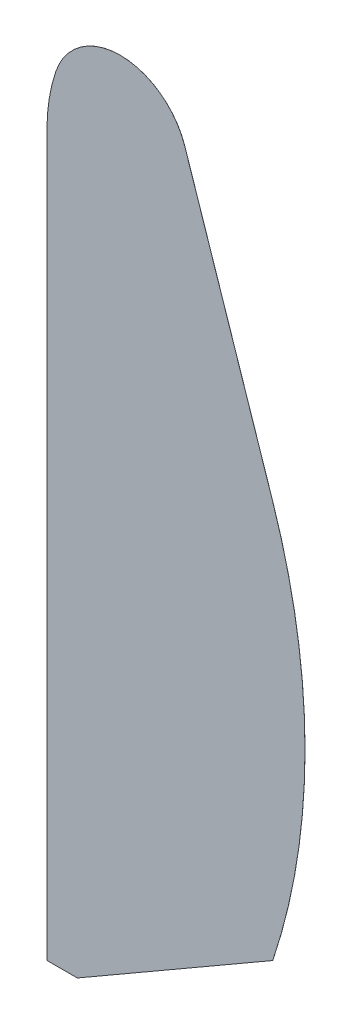
ISO-10303-21;
HEADER;
FILE_DESCRIPTION(('STEP AP214'),'2;1');
FILE_NAME('part.step','',(''),(''),'','','');
FILE_SCHEMA(('AUTOMOTIVE_DESIGN { 1 0 10303 214 1 1 1 1 }'));
ENDSEC;
DATA;
#1=APPLICATION_CONTEXT('core data for automotive mechanical design processes');
#2=APPLICATION_PROTOCOL_DEFINITION('international standard','automotive_design',2000,#1);
#3=PRODUCT_CONTEXT('',#1,'mechanical');
#4=PRODUCT('Part','Part','',(#3));
#5=PRODUCT_RELATED_PRODUCT_CATEGORY('part','',(#4));
#6=PRODUCT_DEFINITION_FORMATION('','',#4);
#7=PRODUCT_DEFINITION_CONTEXT('part definition',#1,'design');
#8=PRODUCT_DEFINITION('design','',#6,#7);
#9=PRODUCT_DEFINITION_SHAPE('','',#8);
#10=(LENGTH_UNIT() NAMED_UNIT(*) SI_UNIT(.MILLI.,.METRE.));
#11=(NAMED_UNIT(*) PLANE_ANGLE_UNIT() SI_UNIT($,.RADIAN.));
#12=(NAMED_UNIT(*) SI_UNIT($,.STERADIAN.) SOLID_ANGLE_UNIT());
#13=UNCERTAINTY_MEASURE_WITH_UNIT(LENGTH_MEASURE(1.E-05),#10,'distance_accuracy_value','');
#14=(GEOMETRIC_REPRESENTATION_CONTEXT(3) GLOBAL_UNCERTAINTY_ASSIGNED_CONTEXT((#13)) GLOBAL_UNIT_ASSIGNED_CONTEXT((#10,
#11,#12)) REPRESENTATION_CONTEXT('',''));
#15=CARTESIAN_POINT('',(0.,0.,0.));
#16=DIRECTION('',(0.,0.,1.));
#17=DIRECTION('',(1.,0.,0.));
#18=AXIS2_PLACEMENT_3D('',#15,#16,#17);
#19=CARTESIAN_POINT('',(12.0736435261267,123.957520313271,0.01));
#20=DIRECTION('',(0.,0.,-1.));
#21=DIRECTION('',(-1.,0.,0.));
#22=AXIS2_PLACEMENT_3D('',#19,#20,#21);
#23=CYLINDRICAL_SURFACE('',#22,11.1999905058393);
#24=CARTESIAN_POINT('',(12.0736435261267,123.957520313271,0.));
#25=DIRECTION('',(0.,0.,-1.));
#26=DIRECTION('',(-1.,0.,0.));
#27=AXIS2_PLACEMENT_3D('',#24,#25,#26);
#28=CIRCLE('',#27,11.1999905058393);
#29=CARTESIAN_POINT('',(1.44864352612669,127.5,0.));
#30=VERTEX_POINT('',#29);
#31=CARTESIAN_POINT('',(22.6986435261267,127.5,0.));
#32=VERTEX_POINT('',#31);
#33=EDGE_CURVE('E129',#30,#32,#28,.T.);
#34=ORIENTED_EDGE('',*,*,#33,.F.);
#35=DIRECTION('',(0.,0.,-1.));
#36=VECTOR('',#35,1.);
#37=CARTESIAN_POINT('',(1.44864352612669,127.5,0.01));
#38=LINE('',#37,#36);
#39=CARTESIAN_POINT('',(1.44864352612669,127.5,0.01));
#40=VERTEX_POINT('',#39);
#41=EDGE_CURVE('E11',#40,#30,#38,.T.);
#42=ORIENTED_EDGE('',*,*,#41,.F.);
#43=CARTESIAN_POINT('',(12.0736435261267,123.957520313271,0.01));
#44=DIRECTION('',(0.,0.,-1.));
#45=DIRECTION('',(-1.,0.,0.));
#46=AXIS2_PLACEMENT_3D('',#43,#44,#45);
#47=CIRCLE('',#46,11.1999905058393);
#48=CARTESIAN_POINT('',(22.6986435261267,127.5,0.01));
#49=VERTEX_POINT('',#48);
#50=EDGE_CURVE('E144',#40,#49,#47,.T.);
#51=ORIENTED_EDGE('',*,*,#50,.T.);
#52=DIRECTION('',(0.,0.,-1.));
#53=VECTOR('',#52,1.);
#54=CARTESIAN_POINT('',(22.6986435261267,127.5,0.01));
#55=LINE('',#54,#53);
#56=EDGE_CURVE('E42',#49,#32,#55,.T.);
#57=ORIENTED_EDGE('',*,*,#56,.T.);
#58=EDGE_LOOP('',(#34,#42,#51,#57));
#59=FACE_BOUND('',#58,.T.);
#60=ADVANCED_FACE('F41',(#59),#23,.T.);
#61=CARTESIAN_POINT('',(28.2174985050943,118.575,0.01));
#62=DIRECTION('',(0.,0.,-1.));
#63=DIRECTION('',(-1.,0.,0.));
#64=AXIS2_PLACEMENT_3D('',#61,#62,#63);
#65=CYLINDRICAL_SURFACE('',#64,28.2174985050943);
#66=CARTESIAN_POINT('',(28.2174985050943,118.575,0.));
#67=DIRECTION('',(0.,0.,-1.));
#68=DIRECTION('',(-1.,0.,0.));
#69=AXIS2_PLACEMENT_3D('',#66,#67,#68);
#70=CIRCLE('',#69,28.2174985050943);
#71=CARTESIAN_POINT('',(0.,118.575,0.));
#72=VERTEX_POINT('',#71);
#73=EDGE_CURVE('E141',#72,#30,#70,.T.);
#74=ORIENTED_EDGE('',*,*,#73,.F.);
#75=DIRECTION('',(0.,0.,-1.));
#76=VECTOR('',#75,1.);
#77=CARTESIAN_POINT('',(0.,118.575,0.01));
#78=LINE('',#77,#76);
#79=CARTESIAN_POINT('',(0.,118.575,0.01));
#80=VERTEX_POINT('',#79);
#81=EDGE_CURVE('E49',#80,#72,#78,.T.);
#82=ORIENTED_EDGE('',*,*,#81,.F.);
#83=CARTESIAN_POINT('',(28.2174985050943,118.575,0.01));
#84=DIRECTION('',(0.,0.,-1.));
#85=DIRECTION('',(-1.,0.,0.));
#86=AXIS2_PLACEMENT_3D('',#83,#84,#85);
#87=CIRCLE('',#86,28.2174985050943);
#88=EDGE_CURVE('E125',#80,#40,#87,.T.);
#89=ORIENTED_EDGE('',*,*,#88,.T.);
#90=ORIENTED_EDGE('',*,*,#41,.T.);
#91=EDGE_LOOP('',(#74,#82,#89,#90));
#92=FACE_BOUND('',#91,.T.);
#93=ADVANCED_FACE('F160',(#92),#65,.T.);
#94=CARTESIAN_POINT('',(0.,0.,0.01));
#95=DIRECTION('',(-1.,0.,0.));
#96=DIRECTION('',(0.,0.,1.));
#97=AXIS2_PLACEMENT_3D('',#94,#95,#96);
#98=PLANE('',#97);
#99=DIRECTION('',(0.,1.,0.));
#100=VECTOR('',#99,1.);
#101=CARTESIAN_POINT('',(0.,0.,0.));
#102=LINE('',#101,#100);
#103=CARTESIAN_POINT('',(0.,0.,0.));
#104=VERTEX_POINT('',#103);
#105=EDGE_CURVE('E109',#104,#72,#102,.T.);
#106=ORIENTED_EDGE('',*,*,#105,.F.);
#107=DIRECTION('',(0.,0.,-1.));
#108=VECTOR('',#107,1.);
#109=CARTESIAN_POINT('',(0.,0.,0.01));
#110=LINE('',#109,#108);
#111=CARTESIAN_POINT('',(0.,0.,0.01));
#112=VERTEX_POINT('',#111);
#113=EDGE_CURVE('E102',#112,#104,#110,.T.);
#114=ORIENTED_EDGE('',*,*,#113,.F.);
#115=DIRECTION('',(0.,1.,0.));
#116=VECTOR('',#115,1.);
#117=CARTESIAN_POINT('',(0.,0.,0.01));
#118=LINE('',#117,#116);
#119=EDGE_CURVE('E107',#112,#80,#118,.T.);
#120=ORIENTED_EDGE('',*,*,#119,.T.);
#121=ORIENTED_EDGE('',*,*,#81,.T.);
#122=EDGE_LOOP('',(#106,#114,#120,#121));
#123=FACE_BOUND('',#122,.T.);
#124=ADVANCED_FACE('F106',(#123),#98,.T.);
#125=CARTESIAN_POINT('',(0.,0.,0.01));
#126=DIRECTION('',(0.,1.,0.));
#127=DIRECTION('',(-1.,0.,0.));
#128=AXIS2_PLACEMENT_3D('',#125,#126,#127);
#129=PLANE('',#128);
#130=DIRECTION('',(1.,0.,0.));
#131=VECTOR('',#130,1.);
#132=CARTESIAN_POINT('',(0.,0.,0.));
#133=LINE('',#132,#131);
#134=CARTESIAN_POINT('',(5.,0.,0.));
#135=VERTEX_POINT('',#134);
#136=EDGE_CURVE('E136',#104,#135,#133,.T.);
#137=ORIENTED_EDGE('',*,*,#136,.T.);
#138=DIRECTION('',(0.,0.,-1.));
#139=VECTOR('',#138,1.);
#140=CARTESIAN_POINT('',(5.,0.,0.01));
#141=LINE('',#140,#139);
#142=CARTESIAN_POINT('',(5.,0.,0.01));
#143=VERTEX_POINT('',#142);
#144=EDGE_CURVE('E114',#143,#135,#141,.T.);
#145=ORIENTED_EDGE('',*,*,#144,.F.);
#146=DIRECTION('',(1.,0.,0.));
#147=VECTOR('',#146,1.);
#148=CARTESIAN_POINT('',(0.,0.,0.01));
#149=LINE('',#148,#147);
#150=EDGE_CURVE('E116',#112,#143,#149,.T.);
#151=ORIENTED_EDGE('',*,*,#150,.F.);
#152=ORIENTED_EDGE('',*,*,#113,.T.);
#153=EDGE_LOOP('',(#137,#145,#151,#152));
#154=FACE_BOUND('',#153,.T.);
#155=ADVANCED_FACE('F120',(#154),#129,.F.);
#156=CARTESIAN_POINT('',(5.,0.,0.01));
#157=DIRECTION('',(-0.500000000000001,0.866025403784438,0.));
#158=DIRECTION('',(-0.866025403784438,-0.500000000000001,0.));
#159=AXIS2_PLACEMENT_3D('',#156,#157,#158);
#160=PLANE('',#159);
#161=DIRECTION('',(0.866025403784438,0.500000000000001,0.));
#162=VECTOR('',#161,1.);
#163=CARTESIAN_POINT('',(5.,0.,0.));
#164=LINE('',#163,#162);
#165=CARTESIAN_POINT('',(37.1875,18.5834617895411,0.));
#166=VERTEX_POINT('',#165);
#167=EDGE_CURVE('E137',#135,#166,#164,.T.);
#168=ORIENTED_EDGE('',*,*,#167,.T.);
#169=DIRECTION('',(0.,0.,-1.));
#170=VECTOR('',#169,1.);
#171=CARTESIAN_POINT('',(37.1875,18.5834617895411,0.01));
#172=LINE('',#171,#170);
#173=CARTESIAN_POINT('',(37.1875,18.5834617895411,0.01));
#174=VERTEX_POINT('',#173);
#175=EDGE_CURVE('E149',#174,#166,#172,.T.);
#176=ORIENTED_EDGE('',*,*,#175,.F.);
#177=DIRECTION('',(0.866025403784438,0.500000000000001,0.));
#178=VECTOR('',#177,1.);
#179=CARTESIAN_POINT('',(5.,0.,0.01));
#180=LINE('',#179,#178);
#181=EDGE_CURVE('E123',#143,#174,#180,.T.);
#182=ORIENTED_EDGE('',*,*,#181,.F.);
#183=ORIENTED_EDGE('',*,*,#144,.T.);
#184=EDGE_LOOP('',(#168,#176,#182,#183));
#185=FACE_BOUND('',#184,.T.);
#186=ADVANCED_FACE('F168',(#185),#160,.F.);
#187=CARTESIAN_POINT('',(-60.9798817685137,51.3134341014826,0.01));
#188=DIRECTION('',(0.,0.,-1.));
#189=DIRECTION('',(-1.,0.,0.));
#190=AXIS2_PLACEMENT_3D('',#187,#188,#189);
#191=CYLINDRICAL_SURFACE('',#190,103.479881768514);
#192=CARTESIAN_POINT('',(-60.9798817685137,51.3134341014826,0.));
#193=DIRECTION('',(0.,0.,1.));
#194=DIRECTION('',(1.,0.,0.));
#195=AXIS2_PLACEMENT_3D('',#192,#193,#194);
#196=CIRCLE('',#195,103.479881768514);
#197=CARTESIAN_POINT('',(37.1875,84.0434064134241,0.));
#198=VERTEX_POINT('',#197);
#199=EDGE_CURVE('E134',#166,#198,#196,.T.);
#200=ORIENTED_EDGE('',*,*,#199,.T.);
#201=DIRECTION('',(0.,0.,-1.));
#202=VECTOR('',#201,1.);
#203=CARTESIAN_POINT('',(37.1875,84.0434064134241,0.01));
#204=LINE('',#203,#202);
#205=CARTESIAN_POINT('',(37.1875,84.0434064134241,0.01));
#206=VERTEX_POINT('',#205);
#207=EDGE_CURVE('E151',#206,#198,#204,.T.);
#208=ORIENTED_EDGE('',*,*,#207,.F.);
#209=CARTESIAN_POINT('',(-60.9798817685137,51.3134341014826,0.01));
#210=DIRECTION('',(0.,0.,1.));
#211=DIRECTION('',(1.,0.,0.));
#212=AXIS2_PLACEMENT_3D('',#209,#210,#211);
#213=CIRCLE('',#212,103.479881768514);
#214=EDGE_CURVE('E231',#174,#206,#213,.T.);
#215=ORIENTED_EDGE('',*,*,#214,.F.);
#216=ORIENTED_EDGE('',*,*,#175,.T.);
#217=EDGE_LOOP('',(#200,#208,#215,#216));
#218=FACE_BOUND('',#217,.T.);
#219=ADVANCED_FACE('F172',(#218),#191,.T.);
#220=CARTESIAN_POINT('',(22.6986435261267,127.5,0.01));
#221=DIRECTION('',(0.948661518459364,0.316293097291694,0.));
#222=DIRECTION('',(-0.316293097291694,0.948661518459365,0.));
#223=AXIS2_PLACEMENT_3D('',#220,#221,#222);
#224=PLANE('',#223);
#225=DIRECTION('',(0.316293097291694,-0.948661518459365,0.));
#226=VECTOR('',#225,1.);
#227=CARTESIAN_POINT('',(22.6986435261267,127.5,0.));
#228=LINE('',#227,#226);
#229=EDGE_CURVE('E135',#32,#198,#228,.T.);
#230=ORIENTED_EDGE('',*,*,#229,.F.);
#231=ORIENTED_EDGE('',*,*,#56,.F.);
#232=DIRECTION('',(0.316293097291694,-0.948661518459365,0.));
#233=VECTOR('',#232,1.);
#234=CARTESIAN_POINT('',(22.6986435261267,127.5,0.01));
#235=LINE('',#234,#233);
#236=EDGE_CURVE('E237',#49,#206,#235,.T.);
#237=ORIENTED_EDGE('',*,*,#236,.T.);
#238=ORIENTED_EDGE('',*,*,#207,.T.);
#239=EDGE_LOOP('',(#230,#231,#237,#238));
#240=FACE_BOUND('',#239,.T.);
#241=ADVANCED_FACE('F153',(#240),#224,.T.);
#242=CARTESIAN_POINT('',(12.0736435261267,123.957520313271,0.01));
#243=DIRECTION('',(0.,0.,-1.));
#244=DIRECTION('',(-1.,0.,0.));
#245=AXIS2_PLACEMENT_3D('',#242,#243,#244);
#246=PLANE('',#245);
#247=ORIENTED_EDGE('',*,*,#50,.F.);
#248=ORIENTED_EDGE('',*,*,#88,.F.);
#249=ORIENTED_EDGE('',*,*,#119,.F.);
#250=ORIENTED_EDGE('',*,*,#150,.T.);
#251=ORIENTED_EDGE('',*,*,#181,.T.);
#252=ORIENTED_EDGE('',*,*,#214,.T.);
#253=ORIENTED_EDGE('',*,*,#236,.F.);
#254=EDGE_LOOP('',(#247,#248,#249,#250,#251,#252,#253));
#255=FACE_BOUND('',#254,.T.);
#256=ADVANCED_FACE('F122',(#255),#246,.F.);
#257=CARTESIAN_POINT('',(12.0736435261267,123.957520313271,0.));
#258=DIRECTION('',(0.,0.,-1.));
#259=DIRECTION('',(-1.,0.,0.));
#260=AXIS2_PLACEMENT_3D('',#257,#258,#259);
#261=PLANE('',#260);
#262=ORIENTED_EDGE('',*,*,#33,.T.);
#263=ORIENTED_EDGE('',*,*,#229,.T.);
#264=ORIENTED_EDGE('',*,*,#199,.F.);
#265=ORIENTED_EDGE('',*,*,#167,.F.);
#266=ORIENTED_EDGE('',*,*,#136,.F.);
#267=ORIENTED_EDGE('',*,*,#105,.T.);
#268=ORIENTED_EDGE('',*,*,#73,.T.);
#269=EDGE_LOOP('',(#262,#263,#264,#265,#266,#267,#268));
#270=FACE_BOUND('',#269,.T.);
#271=ADVANCED_FACE('F156',(#270),#261,.T.);
#272=CLOSED_SHELL('',(#60,#93,#124,#155,#186,#219,#241,#256,#271));
#273=MANIFOLD_SOLID_BREP('B2',#272);
#274=ADVANCED_BREP_SHAPE_REPRESENTATION('',(#18,#273),#14);
#275=SHAPE_DEFINITION_REPRESENTATION(#9,#274);
ENDSEC;
END-ISO-10303-21;
